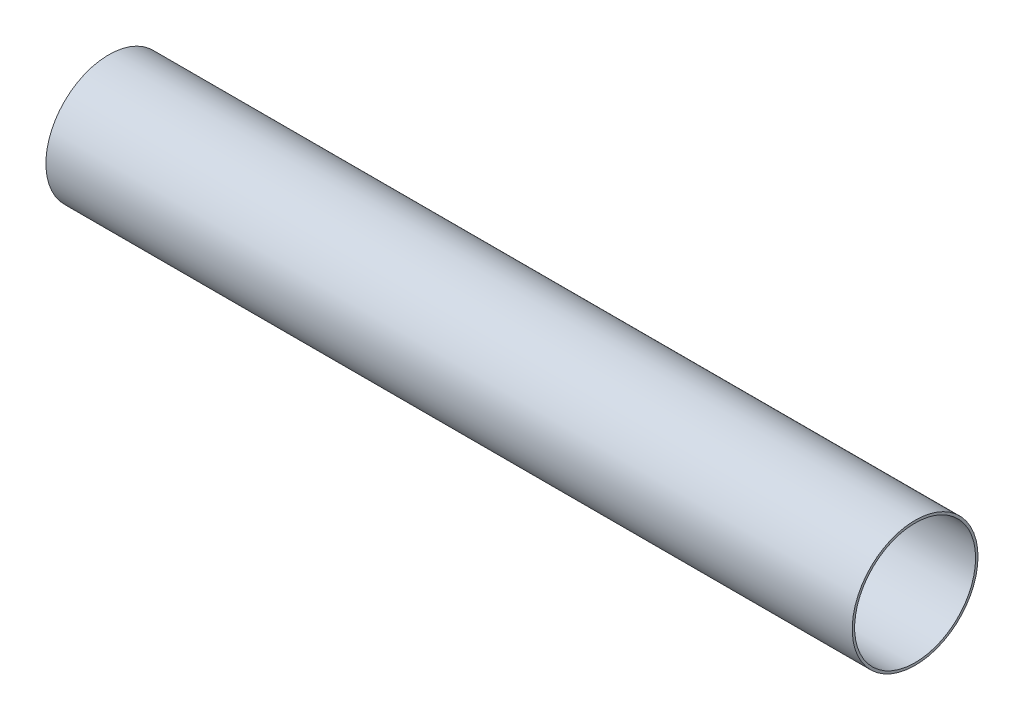
ISO-10303-21;
HEADER;
FILE_DESCRIPTION(('STEP AP214'),'2;1');
FILE_NAME('part.step','',(''),(''),'','','');
FILE_SCHEMA(('AUTOMOTIVE_DESIGN { 1 0 10303 214 1 1 1 1 }'));
ENDSEC;
DATA;
#1=APPLICATION_CONTEXT('core data for automotive mechanical design processes');
#2=APPLICATION_PROTOCOL_DEFINITION('international standard','automotive_design',2000,#1);
#3=PRODUCT_CONTEXT('',#1,'mechanical');
#4=PRODUCT('Part','Part','',(#3));
#5=PRODUCT_RELATED_PRODUCT_CATEGORY('part','',(#4));
#6=PRODUCT_DEFINITION_FORMATION('','',#4);
#7=PRODUCT_DEFINITION_CONTEXT('part definition',#1,'design');
#8=PRODUCT_DEFINITION('design','',#6,#7);
#9=PRODUCT_DEFINITION_SHAPE('','',#8);
#10=(LENGTH_UNIT() NAMED_UNIT(*) SI_UNIT(.MILLI.,.METRE.));
#11=(NAMED_UNIT(*) PLANE_ANGLE_UNIT() SI_UNIT($,.RADIAN.));
#12=(NAMED_UNIT(*) SI_UNIT($,.STERADIAN.) SOLID_ANGLE_UNIT());
#13=UNCERTAINTY_MEASURE_WITH_UNIT(LENGTH_MEASURE(1.E-05),#10,'distance_accuracy_value','');
#14=(GEOMETRIC_REPRESENTATION_CONTEXT(3) GLOBAL_UNCERTAINTY_ASSIGNED_CONTEXT((#13)) GLOBAL_UNIT_ASSIGNED_CONTEXT((#10,
#11,#12)) REPRESENTATION_CONTEXT('',''));
#15=CARTESIAN_POINT('',(0.,0.,0.));
#16=DIRECTION('',(0.,0.,1.));
#17=DIRECTION('',(1.,0.,0.));
#18=AXIS2_PLACEMENT_3D('',#15,#16,#17);
#19=CARTESIAN_POINT('',(508.,0.,0.));
#20=DIRECTION('',(1.,0.,0.));
#21=DIRECTION('',(0.,0.,-1.));
#22=AXIS2_PLACEMENT_3D('',#19,#20,#21);
#23=PLANE('',#22);
#24=CARTESIAN_POINT('',(508.,0.,0.));
#25=DIRECTION('',(1.,0.,0.));
#26=DIRECTION('',(0.,0.,-1.));
#27=AXIS2_PLACEMENT_3D('',#24,#25,#26);
#28=CIRCLE('',#27,39.624);
#29=CARTESIAN_POINT('',(508.,0.,-39.624));
#30=VERTEX_POINT('',#29);
#31=EDGE_CURVE('E10',#30,#30,#28,.T.);
#32=ORIENTED_EDGE('',*,*,#31,.T.);
#33=EDGE_LOOP('',(#32));
#34=FACE_BOUND('',#33,.T.);
#35=CARTESIAN_POINT('',(508.,0.,0.));
#36=DIRECTION('',(1.,0.,0.));
#37=DIRECTION('',(0.,0.,-1.));
#38=AXIS2_PLACEMENT_3D('',#35,#36,#37);
#39=CIRCLE('',#38,38.1);
#40=CARTESIAN_POINT('',(508.,0.,-38.1));
#41=VERTEX_POINT('',#40);
#42=EDGE_CURVE('E56',#41,#41,#39,.T.);
#43=ORIENTED_EDGE('',*,*,#42,.F.);
#44=EDGE_LOOP('',(#43));
#45=FACE_BOUND('',#44,.T.);
#46=ADVANCED_FACE('F43',(#34,#45),#23,.T.);
#47=CARTESIAN_POINT('',(0.,0.,0.));
#48=DIRECTION('',(1.,0.,0.));
#49=DIRECTION('',(0.,0.,-1.));
#50=AXIS2_PLACEMENT_3D('',#47,#48,#49);
#51=PLANE('',#50);
#52=CARTESIAN_POINT('',(0.,0.,0.));
#53=DIRECTION('',(1.,0.,0.));
#54=DIRECTION('',(0.,0.,-1.));
#55=AXIS2_PLACEMENT_3D('',#52,#53,#54);
#56=CIRCLE('',#55,39.624);
#57=CARTESIAN_POINT('',(0.,0.,-39.624));
#58=VERTEX_POINT('',#57);
#59=EDGE_CURVE('E47',#58,#58,#56,.T.);
#60=ORIENTED_EDGE('',*,*,#59,.F.);
#61=EDGE_LOOP('',(#60));
#62=FACE_BOUND('',#61,.T.);
#63=CARTESIAN_POINT('',(0.,0.,0.));
#64=DIRECTION('',(1.,0.,0.));
#65=DIRECTION('',(0.,0.,-1.));
#66=AXIS2_PLACEMENT_3D('',#63,#64,#65);
#67=CIRCLE('',#66,38.1);
#68=CARTESIAN_POINT('',(0.,0.,-38.1));
#69=VERTEX_POINT('',#68);
#70=EDGE_CURVE('E58',#69,#69,#67,.T.);
#71=ORIENTED_EDGE('',*,*,#70,.T.);
#72=EDGE_LOOP('',(#71));
#73=FACE_BOUND('',#72,.T.);
#74=ADVANCED_FACE('F70',(#62,#73),#51,.F.);
#75=CARTESIAN_POINT('',(508.,0.,0.));
#76=DIRECTION('',(-1.,0.,0.));
#77=DIRECTION('',(0.,0.,1.));
#78=AXIS2_PLACEMENT_3D('',#75,#76,#77);
#79=CYLINDRICAL_SURFACE('',#78,39.624);
#80=ORIENTED_EDGE('',*,*,#31,.F.);
#81=EDGE_LOOP('',(#80));
#82=FACE_BOUND('',#81,.T.);
#83=ORIENTED_EDGE('',*,*,#59,.T.);
#84=EDGE_LOOP('',(#83));
#85=FACE_BOUND('',#84,.T.);
#86=ADVANCED_FACE('F45',(#82,#85),#79,.T.);
#87=CARTESIAN_POINT('',(508.,0.,0.));
#88=DIRECTION('',(-1.,0.,0.));
#89=DIRECTION('',(0.,0.,1.));
#90=AXIS2_PLACEMENT_3D('',#87,#88,#89);
#91=CYLINDRICAL_SURFACE('',#90,38.1);
#92=ORIENTED_EDGE('',*,*,#42,.T.);
#93=EDGE_LOOP('',(#92));
#94=FACE_BOUND('',#93,.T.);
#95=ORIENTED_EDGE('',*,*,#70,.F.);
#96=EDGE_LOOP('',(#95));
#97=FACE_BOUND('',#96,.T.);
#98=ADVANCED_FACE('F66',(#94,#97),#91,.F.);
#99=CLOSED_SHELL('',(#46,#74,#86,#98));
#100=MANIFOLD_SOLID_BREP('B2',#99);
#101=ADVANCED_BREP_SHAPE_REPRESENTATION('',(#18,#100),#14);
#102=SHAPE_DEFINITION_REPRESENTATION(#9,#101);
ENDSEC;
END-ISO-10303-21;
